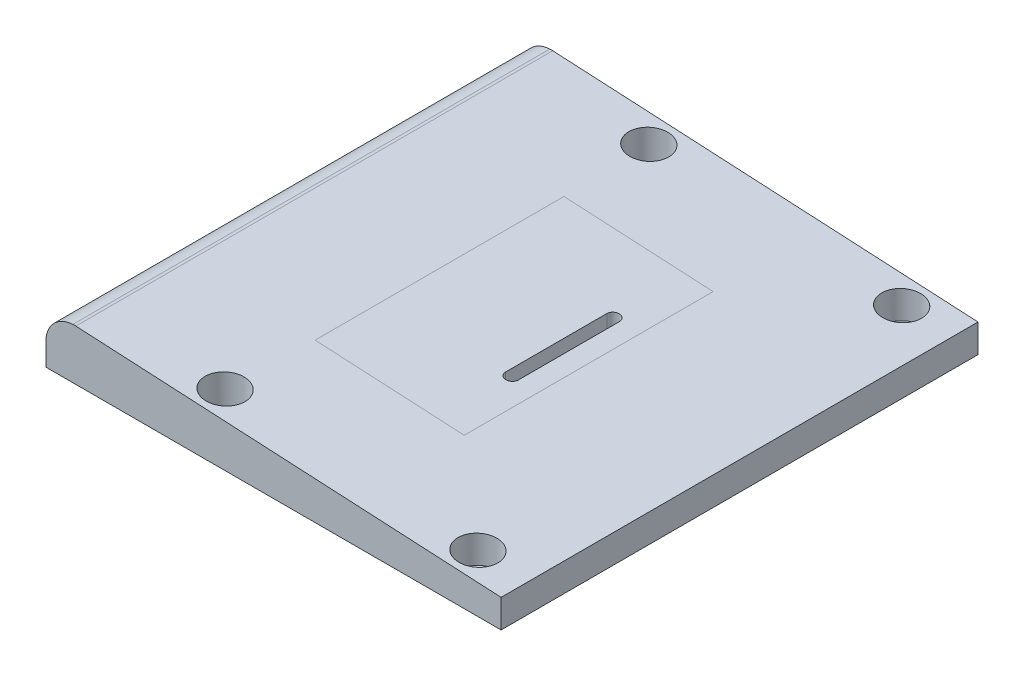
ISO-10303-21;
HEADER;
FILE_DESCRIPTION(('STEP AP214'),'2;1');
FILE_NAME('part.step','',(''),(''),'','','');
FILE_SCHEMA(('AUTOMOTIVE_DESIGN { 1 0 10303 214 1 1 1 1 }'));
ENDSEC;
DATA;
#1=APPLICATION_CONTEXT('core data for automotive mechanical design processes');
#2=APPLICATION_PROTOCOL_DEFINITION('international standard','automotive_design',2000,#1);
#3=PRODUCT_CONTEXT('',#1,'mechanical');
#4=PRODUCT('Part','Part','',(#3));
#5=PRODUCT_RELATED_PRODUCT_CATEGORY('part','',(#4));
#6=PRODUCT_DEFINITION_FORMATION('','',#4);
#7=PRODUCT_DEFINITION_CONTEXT('part definition',#1,'design');
#8=PRODUCT_DEFINITION('design','',#6,#7);
#9=PRODUCT_DEFINITION_SHAPE('','',#8);
#10=(LENGTH_UNIT() NAMED_UNIT(*) SI_UNIT(.MILLI.,.METRE.));
#11=(NAMED_UNIT(*) PLANE_ANGLE_UNIT() SI_UNIT($,.RADIAN.));
#12=(NAMED_UNIT(*) SI_UNIT($,.STERADIAN.) SOLID_ANGLE_UNIT());
#13=UNCERTAINTY_MEASURE_WITH_UNIT(LENGTH_MEASURE(1.E-05),#10,'distance_accuracy_value','');
#14=(GEOMETRIC_REPRESENTATION_CONTEXT(3) GLOBAL_UNCERTAINTY_ASSIGNED_CONTEXT((#13)) GLOBAL_UNIT_ASSIGNED_CONTEXT((#10,
#11,#12)) REPRESENTATION_CONTEXT('',''));
#15=CARTESIAN_POINT('',(0.,0.,0.));
#16=DIRECTION('',(0.,0.,1.));
#17=DIRECTION('',(1.,0.,0.));
#18=AXIS2_PLACEMENT_3D('',#15,#16,#17);
#19=CARTESIAN_POINT('',(0.742449908830771,14.1667881941932,-119.775));
#20=DIRECTION('',(0.0523359562429369,0.998629534754574,0.));
#21=DIRECTION('',(-0.998629534754574,0.0523359562429369,0.));
#22=AXIS2_PLACEMENT_3D('',#19,#20,#21);
#23=PLANE('',#22);
#24=DIRECTION('',(-0.998629534754574,0.0523359562429369,0.));
#25=VECTOR('',#24,1.);
#26=CARTESIAN_POINT('',(0.742449908830771,14.1667881941932,-62.5));
#27=LINE('',#26,#25);
#28=CARTESIAN_POINT('',(-75.7958688581697,18.1779915108286,-62.5));
#29=VERTEX_POINT('',#28);
#30=CARTESIAN_POINT('',(-150.693083964763,22.1031882290489,-62.5));
#31=VERTEX_POINT('',#30);
#32=EDGE_CURVE('E138',#29,#31,#27,.T.);
#33=ORIENTED_EDGE('',*,*,#32,.T.);
#34=DIRECTION('',(0.,0.,1.));
#35=VECTOR('',#34,1.);
#36=CARTESIAN_POINT('',(-150.693083964763,22.1031882290489,-119.775));
#37=LINE('',#36,#35);
#38=CARTESIAN_POINT('',(-150.693083964763,22.1031882290489,62.5));
#39=VERTEX_POINT('',#38);
#40=EDGE_CURVE('E149',#31,#39,#37,.T.);
#41=ORIENTED_EDGE('',*,*,#40,.T.);
#42=DIRECTION('',(0.998629534754574,-0.0523359562429369,0.));
#43=VECTOR('',#42,1.);
#44=CARTESIAN_POINT('',(0.742449908830805,14.1667881941932,62.5));
#45=LINE('',#44,#43);
#46=CARTESIAN_POINT('',(-75.7958688581697,18.1779915108286,62.5));
#47=VERTEX_POINT('',#46);
#48=EDGE_CURVE('E147',#39,#47,#45,.T.);
#49=ORIENTED_EDGE('',*,*,#48,.T.);
#50=DIRECTION('',(0.,0.,-1.));
#51=VECTOR('',#50,1.);
#52=CARTESIAN_POINT('',(-75.7958688581697,18.1779915108286,-119.775));
#53=LINE('',#52,#51);
#54=EDGE_CURVE('E131',#47,#29,#53,.T.);
#55=ORIENTED_EDGE('',*,*,#54,.T.);
#56=EDGE_LOOP('',(#33,#41,#49,#55));
#57=FACE_BOUND('',#56,.T.);
#58=DIRECTION('',(0.,0.,1.));
#59=VECTOR('',#58,1.);
#60=CARTESIAN_POINT('',(-85.725,18.698355224182,-119.775));
#61=LINE('',#60,#59);
#62=CARTESIAN_POINT('',(-85.725,18.698355224182,-25.4));
#63=VERTEX_POINT('',#62);
#64=CARTESIAN_POINT('',(-85.725,18.698355224182,25.4));
#65=VERTEX_POINT('',#64);
#66=EDGE_CURVE('E97',#63,#65,#61,.T.);
#67=ORIENTED_EDGE('',*,*,#66,.T.);
#68=CARTESIAN_POINT('',(-88.9,18.8647499234056,25.4));
#69=DIRECTION('',(0.0523359562429369,0.998629534754574,0.));
#70=DIRECTION('',(0.998629534754574,-0.0523359562429369,0.));
#71=AXIS2_PLACEMENT_3D('',#68,#69,#70);
#72=ELLIPSE('',#71,3.17935719854344,3.17500000000004);
#73=CARTESIAN_POINT('',(-92.075,19.0311446226293,25.4));
#74=VERTEX_POINT('',#73);
#75=EDGE_CURVE('E163',#65,#74,#72,.F.);
#76=ORIENTED_EDGE('',*,*,#75,.T.);
#77=DIRECTION('',(0.,0.,-1.));
#78=VECTOR('',#77,1.);
#79=CARTESIAN_POINT('',(-92.075,19.0311446226293,-119.775));
#80=LINE('',#79,#78);
#81=CARTESIAN_POINT('',(-92.075,19.0311446226293,-25.4));
#82=VERTEX_POINT('',#81);
#83=EDGE_CURVE('E178',#74,#82,#80,.T.);
#84=ORIENTED_EDGE('',*,*,#83,.T.);
#85=CARTESIAN_POINT('',(-88.9,18.8647499234056,-25.4));
#86=DIRECTION('',(0.0523359562429369,0.998629534754574,0.));
#87=DIRECTION('',(0.998629534754574,-0.0523359562429369,0.));
#88=AXIS2_PLACEMENT_3D('',#85,#86,#87);
#89=ELLIPSE('',#88,3.17935719854344,3.17500000000004);
#90=EDGE_CURVE('E181',#82,#63,#89,.F.);
#91=ORIENTED_EDGE('',*,*,#90,.T.);
#92=EDGE_LOOP('',(#67,#76,#84,#91));
#93=FACE_BOUND('',#92,.T.);
#94=ADVANCED_FACE('F54',(#57,#93),#23,.T.);
#95=CARTESIAN_POINT('',(0.,0.,0.));
#96=DIRECTION('',(0.,-1.,0.));
#97=DIRECTION('',(0.,0.,-1.));
#98=AXIS2_PLACEMENT_3D('',#95,#96,#97);
#99=PLANE('',#98);
#100=DIRECTION('',(-1.,0.,0.));
#101=VECTOR('',#100,1.);
#102=CARTESIAN_POINT('',(0.,0.,62.5));
#103=LINE('',#102,#101);
#104=CARTESIAN_POINT('',(-76.748537025078,0.,62.5));
#105=VERTEX_POINT('',#104);
#106=CARTESIAN_POINT('',(-151.851462974922,0.,62.5));
#107=VERTEX_POINT('',#106);
#108=EDGE_CURVE('E157',#105,#107,#103,.T.);
#109=ORIENTED_EDGE('',*,*,#108,.T.);
#110=DIRECTION('',(0.,0.,-1.));
#111=VECTOR('',#110,1.);
#112=CARTESIAN_POINT('',(-151.851462974922,0.,0.));
#113=LINE('',#112,#111);
#114=CARTESIAN_POINT('',(-151.851462974922,0.,-62.5));
#115=VERTEX_POINT('',#114);
#116=EDGE_CURVE('E160',#107,#115,#113,.T.);
#117=ORIENTED_EDGE('',*,*,#116,.T.);
#118=DIRECTION('',(1.,0.,0.));
#119=VECTOR('',#118,1.);
#120=CARTESIAN_POINT('',(0.,0.,-62.5));
#121=LINE('',#120,#119);
#122=CARTESIAN_POINT('',(-76.748537025078,0.,-62.5));
#123=VERTEX_POINT('',#122);
#124=EDGE_CURVE('E154',#115,#123,#121,.T.);
#125=ORIENTED_EDGE('',*,*,#124,.T.);
#126=DIRECTION('',(0.,0.,1.));
#127=VECTOR('',#126,1.);
#128=CARTESIAN_POINT('',(-76.748537025078,0.,0.));
#129=LINE('',#128,#127);
#130=EDGE_CURVE('E134',#123,#105,#129,.T.);
#131=ORIENTED_EDGE('',*,*,#130,.T.);
#132=EDGE_LOOP('',(#109,#117,#125,#131));
#133=FACE_BOUND('',#132,.T.);
#134=DIRECTION('',(0.,0.,-1.));
#135=VECTOR('',#134,1.);
#136=CARTESIAN_POINT('',(-92.075,0.,0.));
#137=LINE('',#136,#135);
#138=CARTESIAN_POINT('',(-92.075,0.,-25.4));
#139=VERTEX_POINT('',#138);
#140=CARTESIAN_POINT('',(-92.075,0.,25.4));
#141=VERTEX_POINT('',#140);
#142=EDGE_CURVE('E136',#139,#141,#137,.F.);
#143=ORIENTED_EDGE('',*,*,#142,.T.);
#144=CARTESIAN_POINT('',(-88.9,0.,25.4));
#145=DIRECTION('',(0.,-1.,0.));
#146=DIRECTION('',(0.,0.,-1.));
#147=AXIS2_PLACEMENT_3D('',#144,#145,#146);
#148=CIRCLE('',#147,3.17500000000004);
#149=CARTESIAN_POINT('',(-85.725,0.,25.4));
#150=VERTEX_POINT('',#149);
#151=EDGE_CURVE('E13',#141,#150,#148,.F.);
#152=ORIENTED_EDGE('',*,*,#151,.T.);
#153=DIRECTION('',(0.,0.,-1.));
#154=VECTOR('',#153,1.);
#155=CARTESIAN_POINT('',(-85.725,0.,0.));
#156=LINE('',#155,#154);
#157=CARTESIAN_POINT('',(-85.725,0.,-25.4));
#158=VERTEX_POINT('',#157);
#159=EDGE_CURVE('E63',#150,#158,#156,.T.);
#160=ORIENTED_EDGE('',*,*,#159,.T.);
#161=CARTESIAN_POINT('',(-88.9,0.,-25.4));
#162=DIRECTION('',(0.,-1.,0.));
#163=DIRECTION('',(0.,0.,-1.));
#164=AXIS2_PLACEMENT_3D('',#161,#162,#163);
#165=CIRCLE('',#164,3.17500000000004);
#166=EDGE_CURVE('E88',#158,#139,#165,.F.);
#167=ORIENTED_EDGE('',*,*,#166,.T.);
#168=EDGE_LOOP('',(#143,#152,#160,#167));
#169=FACE_BOUND('',#168,.T.);
#170=ADVANCED_FACE('F56',(#133,#169),#99,.T.);
#171=CARTESIAN_POINT('',(-77.164989485969,-7.9463863302033,-62.5));
#172=DIRECTION('',(0.,0.,-1.));
#173=DIRECTION('',(-1.,0.,0.));
#174=AXIS2_PLACEMENT_3D('',#171,#172,#173);
#175=PLANE('',#174);
#176=ORIENTED_EDGE('',*,*,#124,.F.);
#177=DIRECTION('',(0.0523359562429369,0.998629534754574,0.));
#178=VECTOR('',#177,1.);
#179=CARTESIAN_POINT('',(-152.062204592562,-4.02118961198303,-62.5));
#180=LINE('',#179,#178);
#181=EDGE_CURVE('E122',#115,#31,#180,.T.);
#182=ORIENTED_EDGE('',*,*,#181,.T.);
#183=ORIENTED_EDGE('',*,*,#32,.F.);
#184=DIRECTION('',(0.0523359562429369,0.998629534754574,0.));
#185=VECTOR('',#184,1.);
#186=CARTESIAN_POINT('',(-77.164989485969,-7.9463863302033,-62.5));
#187=LINE('',#186,#185);
#188=EDGE_CURVE('E128',#123,#29,#187,.T.);
#189=ORIENTED_EDGE('',*,*,#188,.F.);
#190=EDGE_LOOP('',(#176,#182,#183,#189));
#191=FACE_BOUND('',#190,.T.);
#192=ADVANCED_FACE('F139',(#191),#175,.T.);
#193=CARTESIAN_POINT('',(-152.062204592562,-4.02118961198303,62.5));
#194=DIRECTION('',(-0.998629534754574,0.0523359562429369,0.));
#195=DIRECTION('',(-0.0523359562429369,-0.998629534754574,0.));
#196=AXIS2_PLACEMENT_3D('',#193,#194,#195);
#197=PLANE('',#196);
#198=ORIENTED_EDGE('',*,*,#116,.F.);
#199=DIRECTION('',(0.0523359562429369,0.998629534754574,0.));
#200=VECTOR('',#199,1.);
#201=CARTESIAN_POINT('',(-152.062204592562,-4.02118961198303,62.5));
#202=LINE('',#201,#200);
#203=EDGE_CURVE('E143',#107,#39,#202,.T.);
#204=ORIENTED_EDGE('',*,*,#203,.T.);
#205=ORIENTED_EDGE('',*,*,#40,.F.);
#206=ORIENTED_EDGE('',*,*,#181,.F.);
#207=EDGE_LOOP('',(#198,#204,#205,#206));
#208=FACE_BOUND('',#207,.T.);
#209=ADVANCED_FACE('F196',(#208),#197,.T.);
#210=CARTESIAN_POINT('',(-77.164989485969,-7.9463863302033,62.5));
#211=DIRECTION('',(0.998629534754574,-0.0523359562429369,0.));
#212=DIRECTION('',(0.0523359562429369,0.998629534754574,0.));
#213=AXIS2_PLACEMENT_3D('',#210,#211,#212);
#214=PLANE('',#213);
#215=ORIENTED_EDGE('',*,*,#130,.F.);
#216=ORIENTED_EDGE('',*,*,#188,.T.);
#217=ORIENTED_EDGE('',*,*,#54,.F.);
#218=DIRECTION('',(0.0523359562429369,0.998629534754574,0.));
#219=VECTOR('',#218,1.);
#220=CARTESIAN_POINT('',(-77.164989485969,-7.9463863302033,62.5));
#221=LINE('',#220,#219);
#222=EDGE_CURVE('E193',#105,#47,#221,.T.);
#223=ORIENTED_EDGE('',*,*,#222,.F.);
#224=EDGE_LOOP('',(#215,#216,#217,#223));
#225=FACE_BOUND('',#224,.T.);
#226=ADVANCED_FACE('F129',(#225),#214,.T.);
#227=CARTESIAN_POINT('',(-77.164989485969,-7.9463863302033,62.5));
#228=DIRECTION('',(0.,0.,1.));
#229=DIRECTION('',(1.,0.,0.));
#230=AXIS2_PLACEMENT_3D('',#227,#228,#229);
#231=PLANE('',#230);
#232=ORIENTED_EDGE('',*,*,#108,.F.);
#233=ORIENTED_EDGE('',*,*,#222,.T.);
#234=ORIENTED_EDGE('',*,*,#48,.F.);
#235=ORIENTED_EDGE('',*,*,#203,.F.);
#236=EDGE_LOOP('',(#232,#233,#234,#235));
#237=FACE_BOUND('',#236,.T.);
#238=ADVANCED_FACE('F199',(#237),#231,.T.);
#239=CARTESIAN_POINT('',(-88.9,25.4,25.4));
#240=DIRECTION('',(0.,-1.,0.));
#241=DIRECTION('',(0.,0.,-1.));
#242=AXIS2_PLACEMENT_3D('',#239,#240,#241);
#243=CYLINDRICAL_SURFACE('',#242,3.17500000000004);
#244=DIRECTION('',(0.,-1.,0.));
#245=VECTOR('',#244,1.);
#246=CARTESIAN_POINT('',(-85.725,25.4,25.4));
#247=LINE('',#246,#245);
#248=EDGE_CURVE('E172',#65,#150,#247,.T.);
#249=ORIENTED_EDGE('',*,*,#248,.T.);
#250=ORIENTED_EDGE('',*,*,#151,.F.);
#251=DIRECTION('',(0.,-1.,0.));
#252=VECTOR('',#251,1.);
#253=CARTESIAN_POINT('',(-92.075,25.4,25.4));
#254=LINE('',#253,#252);
#255=EDGE_CURVE('E185',#74,#141,#254,.T.);
#256=ORIENTED_EDGE('',*,*,#255,.F.);
#257=ORIENTED_EDGE('',*,*,#75,.F.);
#258=EDGE_LOOP('',(#249,#250,#256,#257));
#259=FACE_BOUND('',#258,.T.);
#260=ADVANCED_FACE('F175',(#259),#243,.F.);
#261=CARTESIAN_POINT('',(-85.725,25.4,25.4));
#262=DIRECTION('',(-1.,0.,0.));
#263=DIRECTION('',(0.,0.,1.));
#264=AXIS2_PLACEMENT_3D('',#261,#262,#263);
#265=PLANE('',#264);
#266=DIRECTION('',(0.,-1.,0.));
#267=VECTOR('',#266,1.);
#268=CARTESIAN_POINT('',(-85.725,25.4,-25.4));
#269=LINE('',#268,#267);
#270=EDGE_CURVE('E173',#63,#158,#269,.T.);
#271=ORIENTED_EDGE('',*,*,#270,.T.);
#272=ORIENTED_EDGE('',*,*,#159,.F.);
#273=ORIENTED_EDGE('',*,*,#248,.F.);
#274=ORIENTED_EDGE('',*,*,#66,.F.);
#275=EDGE_LOOP('',(#271,#272,#273,#274));
#276=FACE_BOUND('',#275,.T.);
#277=ADVANCED_FACE('F171',(#276),#265,.T.);
#278=CARTESIAN_POINT('',(-88.9,25.4,-25.4));
#279=DIRECTION('',(0.,-1.,0.));
#280=DIRECTION('',(0.,0.,-1.));
#281=AXIS2_PLACEMENT_3D('',#278,#279,#280);
#282=CYLINDRICAL_SURFACE('',#281,3.17500000000004);
#283=DIRECTION('',(0.,-1.,0.));
#284=VECTOR('',#283,1.);
#285=CARTESIAN_POINT('',(-92.075,25.4,-25.4));
#286=LINE('',#285,#284);
#287=EDGE_CURVE('E71',#82,#139,#286,.T.);
#288=ORIENTED_EDGE('',*,*,#287,.T.);
#289=ORIENTED_EDGE('',*,*,#166,.F.);
#290=ORIENTED_EDGE('',*,*,#270,.F.);
#291=ORIENTED_EDGE('',*,*,#90,.F.);
#292=EDGE_LOOP('',(#288,#289,#290,#291));
#293=FACE_BOUND('',#292,.T.);
#294=ADVANCED_FACE('F222',(#293),#282,.F.);
#295=CARTESIAN_POINT('',(-92.075,25.4,-25.4));
#296=DIRECTION('',(1.,0.,0.));
#297=DIRECTION('',(0.,0.,-1.));
#298=AXIS2_PLACEMENT_3D('',#295,#296,#297);
#299=PLANE('',#298);
#300=ORIENTED_EDGE('',*,*,#255,.T.);
#301=ORIENTED_EDGE('',*,*,#142,.F.);
#302=ORIENTED_EDGE('',*,*,#287,.F.);
#303=ORIENTED_EDGE('',*,*,#83,.F.);
#304=EDGE_LOOP('',(#300,#301,#302,#303));
#305=FACE_BOUND('',#304,.T.);
#306=ADVANCED_FACE('F225',(#305),#299,.T.);
#307=CLOSED_SHELL('',(#94,#170,#192,#209,#226,#238,#260,#277,#294,#306));
#308=MANIFOLD_SOLID_BREP('B2',#307);
#309=CARTESIAN_POINT('',(-77.164989485969,-7.9463863302033,-62.5));
#310=DIRECTION('',(0.,0.,-1.));
#311=DIRECTION('',(-1.,0.,0.));
#312=AXIS2_PLACEMENT_3D('',#309,#310,#311);
#313=PLANE('',#312);
#314=DIRECTION('',(1.,0.,0.));
#315=VECTOR('',#314,1.);
#316=CARTESIAN_POINT('',(0.,0.,-62.5));
#317=LINE('',#316,#315);
#318=CARTESIAN_POINT('',(-151.851462974922,0.,-62.5));
#319=VERTEX_POINT('',#318);
#320=CARTESIAN_POINT('',(-76.748537025078,0.,-62.5));
#321=VERTEX_POINT('',#320);
#322=EDGE_CURVE('E430',#319,#321,#317,.T.);
#323=ORIENTED_EDGE('',*,*,#322,.T.);
#324=DIRECTION('',(0.0523359562429369,0.998629534754574,0.));
#325=VECTOR('',#324,1.);
#326=CARTESIAN_POINT('',(-77.164989485969,-7.9463863302033,-62.5));
#327=LINE('',#326,#325);
#328=CARTESIAN_POINT('',(-75.7958688581697,18.1779915108286,-62.5));
#329=VERTEX_POINT('',#328);
#330=EDGE_CURVE('E52',#321,#329,#327,.T.);
#331=ORIENTED_EDGE('',*,*,#330,.T.);
#332=DIRECTION('',(-0.998629534754574,0.0523359562429369,0.));
#333=VECTOR('',#332,1.);
#334=CARTESIAN_POINT('',(0.742449908830771,14.1667881941932,-62.5));
#335=LINE('',#334,#333);
#336=CARTESIAN_POINT('',(-150.693083964763,22.1031882290489,-62.5));
#337=VERTEX_POINT('',#336);
#338=EDGE_CURVE('E292',#329,#337,#335,.T.);
#339=ORIENTED_EDGE('',*,*,#338,.T.);
#340=DIRECTION('',(0.0523359562429369,0.998629534754574,0.));
#341=VECTOR('',#340,1.);
#342=CARTESIAN_POINT('',(-152.062204592562,-4.02118961198303,-62.5));
#343=LINE('',#342,#341);
#344=EDGE_CURVE('E284',#319,#337,#343,.T.);
#345=ORIENTED_EDGE('',*,*,#344,.F.);
#346=EDGE_LOOP('',(#323,#331,#339,#345));
#347=FACE_BOUND('',#346,.T.);
#348=ADVANCED_FACE('F275',(#347),#313,.F.);
#349=CARTESIAN_POINT('',(-77.164989485969,-7.9463863302033,62.5));
#350=DIRECTION('',(0.998629534754574,-0.0523359562429369,0.));
#351=DIRECTION('',(0.0523359562429369,0.998629534754574,0.));
#352=AXIS2_PLACEMENT_3D('',#349,#350,#351);
#353=PLANE('',#352);
#354=DIRECTION('',(0.,0.,1.));
#355=VECTOR('',#354,1.);
#356=CARTESIAN_POINT('',(-76.748537025078,0.,0.));
#357=LINE('',#356,#355);
#358=CARTESIAN_POINT('',(-76.748537025078,0.,62.5));
#359=VERTEX_POINT('',#358);
#360=EDGE_CURVE('E439',#321,#359,#357,.T.);
#361=ORIENTED_EDGE('',*,*,#360,.T.);
#362=DIRECTION('',(0.0523359562429369,0.998629534754574,0.));
#363=VECTOR('',#362,1.);
#364=CARTESIAN_POINT('',(-77.164989485969,-7.9463863302033,62.5));
#365=LINE('',#364,#363);
#366=CARTESIAN_POINT('',(-75.7958688581697,18.1779915108286,62.5));
#367=VERTEX_POINT('',#366);
#368=EDGE_CURVE('E433',#359,#367,#365,.T.);
#369=ORIENTED_EDGE('',*,*,#368,.T.);
#370=DIRECTION('',(0.,0.,-1.));
#371=VECTOR('',#370,1.);
#372=CARTESIAN_POINT('',(-75.7958688581697,18.1779915108286,-119.775));
#373=LINE('',#372,#371);
#374=EDGE_CURVE('E421',#367,#329,#373,.T.);
#375=ORIENTED_EDGE('',*,*,#374,.T.);
#376=ORIENTED_EDGE('',*,*,#330,.F.);
#377=EDGE_LOOP('',(#361,#369,#375,#376));
#378=FACE_BOUND('',#377,.T.);
#379=ADVANCED_FACE('F454',(#378),#353,.F.);
#380=CARTESIAN_POINT('',(-77.164989485969,-7.9463863302033,62.5));
#381=DIRECTION('',(0.,0.,1.));
#382=DIRECTION('',(1.,0.,0.));
#383=AXIS2_PLACEMENT_3D('',#380,#381,#382);
#384=PLANE('',#383);
#385=DIRECTION('',(-1.,0.,0.));
#386=VECTOR('',#385,1.);
#387=CARTESIAN_POINT('',(0.,0.,62.5));
#388=LINE('',#387,#386);
#389=CARTESIAN_POINT('',(-151.851462974922,0.,62.5));
#390=VERTEX_POINT('',#389);
#391=EDGE_CURVE('E440',#359,#390,#388,.T.);
#392=ORIENTED_EDGE('',*,*,#391,.T.);
#393=DIRECTION('',(0.0523359562429369,0.998629534754574,0.));
#394=VECTOR('',#393,1.);
#395=CARTESIAN_POINT('',(-152.062204592562,-4.02118961198303,62.5));
#396=LINE('',#395,#394);
#397=CARTESIAN_POINT('',(-150.693083964763,22.1031882290489,62.5));
#398=VERTEX_POINT('',#397);
#399=EDGE_CURVE('E420',#390,#398,#396,.T.);
#400=ORIENTED_EDGE('',*,*,#399,.T.);
#401=DIRECTION('',(0.998629534754574,-0.0523359562429369,0.));
#402=VECTOR('',#401,1.);
#403=CARTESIAN_POINT('',(0.742449908830805,14.1667881941932,62.5));
#404=LINE('',#403,#402);
#405=EDGE_CURVE('E424',#398,#367,#404,.T.);
#406=ORIENTED_EDGE('',*,*,#405,.T.);
#407=ORIENTED_EDGE('',*,*,#368,.F.);
#408=EDGE_LOOP('',(#392,#400,#406,#407));
#409=FACE_BOUND('',#408,.T.);
#410=ADVANCED_FACE('F460',(#409),#384,.F.);
#411=CARTESIAN_POINT('',(-152.062204592562,-4.02118961198303,62.5));
#412=DIRECTION('',(-0.998629534754574,0.0523359562429369,0.));
#413=DIRECTION('',(-0.0523359562429369,-0.998629534754574,0.));
#414=AXIS2_PLACEMENT_3D('',#411,#412,#413);
#415=PLANE('',#414);
#416=DIRECTION('',(0.,0.,-1.));
#417=VECTOR('',#416,1.);
#418=CARTESIAN_POINT('',(-151.851462974922,0.,0.));
#419=LINE('',#418,#417);
#420=EDGE_CURVE('E279',#390,#319,#419,.T.);
#421=ORIENTED_EDGE('',*,*,#420,.T.);
#422=ORIENTED_EDGE('',*,*,#344,.T.);
#423=DIRECTION('',(0.,0.,1.));
#424=VECTOR('',#423,1.);
#425=CARTESIAN_POINT('',(-150.693083964763,22.1031882290489,-119.775));
#426=LINE('',#425,#424);
#427=EDGE_CURVE('E427',#337,#398,#426,.T.);
#428=ORIENTED_EDGE('',*,*,#427,.T.);
#429=ORIENTED_EDGE('',*,*,#399,.F.);
#430=EDGE_LOOP('',(#421,#422,#428,#429));
#431=FACE_BOUND('',#430,.T.);
#432=ADVANCED_FACE('F277',(#431),#415,.F.);
#433=CARTESIAN_POINT('',(-214.350571922434,11.0782345540564,-119.775));
#434=DIRECTION('',(0.,0.,1.));
#435=DIRECTION('',(1.,0.,0.));
#436=AXIS2_PLACEMENT_3D('',#433,#434,#435);
#437=CYLINDRICAL_SURFACE('',#436,14.3414198634365);
#438=DIRECTION('',(0.,0.,1.));
#439=VECTOR('',#438,1.);
#440=CARTESIAN_POINT('',(-215.101143844869,25.4,-119.775));
#441=LINE('',#440,#439);
#442=CARTESIAN_POINT('',(-215.101143844869,25.4,-119.775));
#443=VERTEX_POINT('',#442);
#444=CARTESIAN_POINT('',(-215.101143844869,25.4,119.775));
#445=VERTEX_POINT('',#444);
#446=EDGE_CURVE('E375',#443,#445,#441,.T.);
#447=ORIENTED_EDGE('',*,*,#446,.F.);
#448=CARTESIAN_POINT('',(-214.350571922434,11.0782345540564,-119.775));
#449=DIRECTION('',(0.,0.,1.));
#450=DIRECTION('',(1.,0.,0.));
#451=AXIS2_PLACEMENT_3D('',#448,#449,#450);
#452=CIRCLE('',#451,14.3414198634365);
#453=CARTESIAN_POINT('',(-228.6,12.7,-119.775));
#454=VERTEX_POINT('',#453);
#455=EDGE_CURVE('E515',#443,#454,#452,.T.);
#456=ORIENTED_EDGE('',*,*,#455,.T.);
#457=DIRECTION('',(0.,0.,1.));
#458=VECTOR('',#457,1.);
#459=CARTESIAN_POINT('',(-228.6,12.7,-119.775));
#460=LINE('',#459,#458);
#461=CARTESIAN_POINT('',(-228.6,12.7,119.775));
#462=VERTEX_POINT('',#461);
#463=EDGE_CURVE('E402',#454,#462,#460,.T.);
#464=ORIENTED_EDGE('',*,*,#463,.T.);
#465=CARTESIAN_POINT('',(-214.350571922434,11.0782345540564,119.775));
#466=DIRECTION('',(0.,0.,1.));
#467=DIRECTION('',(1.,0.,0.));
#468=AXIS2_PLACEMENT_3D('',#465,#466,#467);
#469=CIRCLE('',#468,14.3414198634365);
#470=EDGE_CURVE('E371',#445,#462,#469,.T.);
#471=ORIENTED_EDGE('',*,*,#470,.F.);
#472=EDGE_LOOP('',(#447,#456,#464,#471));
#473=FACE_BOUND('',#472,.T.);
#474=ADVANCED_FACE('F470',(#473),#437,.T.);
#475=CARTESIAN_POINT('',(-149.25,1.83965441749289,106.425));
#476=DIRECTION('',(0.,-1.,0.));
#477=DIRECTION('',(0.,0.,-1.));
#478=AXIS2_PLACEMENT_3D('',#475,#476,#477);
#479=PLANE('',#478);
#480=CARTESIAN_POINT('',(-152.,1.83965441749289,106.425));
#481=DIRECTION('',(0.,1.,0.));
#482=DIRECTION('',(0.,0.,1.));
#483=AXIS2_PLACEMENT_3D('',#480,#481,#482);
#484=CIRCLE('',#483,2.75);
#485=CARTESIAN_POINT('',(-152.,1.83965441749289,109.175));
#486=VERTEX_POINT('',#485);
#487=EDGE_CURVE('E525',#486,#486,#484,.T.);
#488=ORIENTED_EDGE('',*,*,#487,.F.);
#489=EDGE_LOOP('',(#488));
#490=FACE_BOUND('',#489,.T.);
#491=CARTESIAN_POINT('',(-152.,1.83965441749289,106.425));
#492=DIRECTION('',(0.,1.,0.));
#493=DIRECTION('',(0.,0.,1.));
#494=AXIS2_PLACEMENT_3D('',#491,#492,#493);
#495=CIRCLE('',#494,9.99999999999998);
#496=CARTESIAN_POINT('',(-152.,1.83965441749289,116.425));
#497=VERTEX_POINT('',#496);
#498=EDGE_CURVE('E407',#497,#497,#495,.T.);
#499=ORIENTED_EDGE('',*,*,#498,.T.);
#500=EDGE_LOOP('',(#499));
#501=FACE_BOUND('',#500,.T.);
#502=ADVANCED_FACE('F475',(#490,#501),#479,.F.);
#503=CARTESIAN_POINT('',(-22.25,1.83965441749289,106.425));
#504=DIRECTION('',(0.,-1.,0.));
#505=DIRECTION('',(0.,0.,-1.));
#506=AXIS2_PLACEMENT_3D('',#503,#504,#505);
#507=PLANE('',#506);
#508=CARTESIAN_POINT('',(-25.,1.83965441749289,106.425));
#509=DIRECTION('',(0.,1.,0.));
#510=DIRECTION('',(0.,0.,1.));
#511=AXIS2_PLACEMENT_3D('',#508,#509,#510);
#512=CIRCLE('',#511,2.75);
#513=CARTESIAN_POINT('',(-25.,1.83965441749289,109.175));
#514=VERTEX_POINT('',#513);
#515=EDGE_CURVE('E532',#514,#514,#512,.T.);
#516=ORIENTED_EDGE('',*,*,#515,.F.);
#517=EDGE_LOOP('',(#516));
#518=FACE_BOUND('',#517,.T.);
#519=CARTESIAN_POINT('',(-25.,1.83965441749289,106.425));
#520=DIRECTION('',(0.,1.,0.));
#521=DIRECTION('',(0.,0.,1.));
#522=AXIS2_PLACEMENT_3D('',#519,#520,#521);
#523=CIRCLE('',#522,9.99999999999999);
#524=CARTESIAN_POINT('',(-25.,1.83965441749289,116.425));
#525=VERTEX_POINT('',#524);
#526=EDGE_CURVE('E412',#525,#525,#523,.T.);
#527=ORIENTED_EDGE('',*,*,#526,.T.);
#528=EDGE_LOOP('',(#527));
#529=FACE_BOUND('',#528,.T.);
#530=ADVANCED_FACE('F575',(#518,#529),#507,.F.);
#531=CARTESIAN_POINT('',(-22.25,1.83965441749289,-106.425));
#532=DIRECTION('',(0.,-1.,0.));
#533=DIRECTION('',(0.,0.,-1.));
#534=AXIS2_PLACEMENT_3D('',#531,#532,#533);
#535=PLANE('',#534);
#536=CARTESIAN_POINT('',(-25.,1.83965441749289,-106.425));
#537=DIRECTION('',(0.,1.,0.));
#538=DIRECTION('',(0.,0.,1.));
#539=AXIS2_PLACEMENT_3D('',#536,#537,#538);
#540=CIRCLE('',#539,2.75);
#541=CARTESIAN_POINT('',(-25.,1.83965441749289,-103.675));
#542=VERTEX_POINT('',#541);
#543=EDGE_CURVE('E539',#542,#542,#540,.T.);
#544=ORIENTED_EDGE('',*,*,#543,.F.);
#545=EDGE_LOOP('',(#544));
#546=FACE_BOUND('',#545,.T.);
#547=CARTESIAN_POINT('',(-25.,1.83965441749289,-106.425));
#548=DIRECTION('',(0.,1.,0.));
#549=DIRECTION('',(0.,0.,1.));
#550=AXIS2_PLACEMENT_3D('',#547,#548,#549);
#551=CIRCLE('',#550,9.99999999999999);
#552=CARTESIAN_POINT('',(-25.,1.83965441749289,-96.425));
#553=VERTEX_POINT('',#552);
#554=EDGE_CURVE('E417',#553,#553,#551,.T.);
#555=ORIENTED_EDGE('',*,*,#554,.T.);
#556=EDGE_LOOP('',(#555));
#557=FACE_BOUND('',#556,.T.);
#558=ADVANCED_FACE('F570',(#546,#557),#535,.F.);
#559=CARTESIAN_POINT('',(-149.25,1.83965441749289,-106.425));
#560=DIRECTION('',(0.,-1.,0.));
#561=DIRECTION('',(0.,0.,-1.));
#562=AXIS2_PLACEMENT_3D('',#559,#560,#561);
#563=PLANE('',#562);
#564=CARTESIAN_POINT('',(-152.,1.83965441749289,-106.425));
#565=DIRECTION('',(0.,1.,0.));
#566=DIRECTION('',(0.,0.,1.));
#567=AXIS2_PLACEMENT_3D('',#564,#565,#566);
#568=CIRCLE('',#567,2.75);
#569=CARTESIAN_POINT('',(-152.,1.83965441749289,-103.675));
#570=VERTEX_POINT('',#569);
#571=EDGE_CURVE('E546',#570,#570,#568,.T.);
#572=ORIENTED_EDGE('',*,*,#571,.F.);
#573=EDGE_LOOP('',(#572));
#574=FACE_BOUND('',#573,.T.);
#575=CARTESIAN_POINT('',(-152.,1.83965441749289,-106.425));
#576=DIRECTION('',(0.,1.,0.));
#577=DIRECTION('',(0.,0.,1.));
#578=AXIS2_PLACEMENT_3D('',#575,#576,#577);
#579=CIRCLE('',#578,9.99999999999998);
#580=CARTESIAN_POINT('',(-152.,1.83965441749289,-96.425));
#581=VERTEX_POINT('',#580);
#582=EDGE_CURVE('E549',#581,#581,#579,.T.);
#583=ORIENTED_EDGE('',*,*,#582,.T.);
#584=EDGE_LOOP('',(#583));
#585=FACE_BOUND('',#584,.T.);
#586=ADVANCED_FACE('F493',(#574,#585),#563,.F.);
#587=CARTESIAN_POINT('',(-228.6,25.4,119.775));
#588=DIRECTION('',(1.,0.,0.));
#589=DIRECTION('',(0.,0.,-1.));
#590=AXIS2_PLACEMENT_3D('',#587,#588,#589);
#591=PLANE('',#590);
#592=ORIENTED_EDGE('',*,*,#463,.F.);
#593=DIRECTION('',(0.,-1.,0.));
#594=VECTOR('',#593,1.);
#595=CARTESIAN_POINT('',(-228.6,25.4,-119.775));
#596=LINE('',#595,#594);
#597=CARTESIAN_POINT('',(-228.6,0.,-119.775));
#598=VERTEX_POINT('',#597);
#599=EDGE_CURVE('E395',#454,#598,#596,.T.);
#600=ORIENTED_EDGE('',*,*,#599,.T.);
#601=DIRECTION('',(0.,0.,1.));
#602=VECTOR('',#601,1.);
#603=CARTESIAN_POINT('',(-228.6,0.,119.775));
#604=LINE('',#603,#602);
#605=CARTESIAN_POINT('',(-228.6,0.,119.775));
#606=VERTEX_POINT('',#605);
#607=EDGE_CURVE('E390',#598,#606,#604,.T.);
#608=ORIENTED_EDGE('',*,*,#607,.T.);
#609=DIRECTION('',(0.,-1.,0.));
#610=VECTOR('',#609,1.);
#611=CARTESIAN_POINT('',(-228.6,25.4,119.775));
#612=LINE('',#611,#610);
#613=EDGE_CURVE('E378',#462,#606,#612,.T.);
#614=ORIENTED_EDGE('',*,*,#613,.F.);
#615=EDGE_LOOP('',(#592,#600,#608,#614));
#616=FACE_BOUND('',#615,.T.);
#617=ADVANCED_FACE('F491',(#616),#591,.F.);
#618=CARTESIAN_POINT('',(-228.6,25.4,119.775));
#619=DIRECTION('',(0.,0.,-1.));
#620=DIRECTION('',(-1.,0.,0.));
#621=AXIS2_PLACEMENT_3D('',#618,#619,#620);
#622=PLANE('',#621);
#623=DIRECTION('',(-0.998629534754574,0.0523359562429369,0.));
#624=VECTOR('',#623,1.);
#625=CARTESIAN_POINT('',(0.742449908830771,14.1667881941932,119.775));
#626=LINE('',#625,#624);
#627=CARTESIAN_POINT('',(0.,14.2056983451439,119.775));
#628=VERTEX_POINT('',#627);
#629=CARTESIAN_POINT('',(-213.6,25.4,119.775));
#630=VERTEX_POINT('',#629);
#631=EDGE_CURVE('E353',#628,#630,#626,.T.);
#632=ORIENTED_EDGE('',*,*,#631,.T.);
#633=DIRECTION('',(1.,0.,0.));
#634=VECTOR('',#633,1.);
#635=CARTESIAN_POINT('',(-228.6,25.4,119.775));
#636=LINE('',#635,#634);
#637=EDGE_CURVE('E368',#445,#630,#636,.T.);
#638=ORIENTED_EDGE('',*,*,#637,.F.);
#639=ORIENTED_EDGE('',*,*,#470,.T.);
#640=ORIENTED_EDGE('',*,*,#613,.T.);
#641=DIRECTION('',(1.,0.,0.));
#642=VECTOR('',#641,1.);
#643=CARTESIAN_POINT('',(-228.6,0.,119.775));
#644=LINE('',#643,#642);
#645=CARTESIAN_POINT('',(0.,0.,119.775));
#646=VERTEX_POINT('',#645);
#647=EDGE_CURVE('E380',#606,#646,#644,.T.);
#648=ORIENTED_EDGE('',*,*,#647,.T.);
#649=DIRECTION('',(0.,-1.,0.));
#650=VECTOR('',#649,1.);
#651=CARTESIAN_POINT('',(0.,25.4,119.775));
#652=LINE('',#651,#650);
#653=EDGE_CURVE('E370',#628,#646,#652,.T.);
#654=ORIENTED_EDGE('',*,*,#653,.F.);
#655=EDGE_LOOP('',(#632,#638,#639,#640,#648,#654));
#656=FACE_BOUND('',#655,.T.);
#657=ADVANCED_FACE('F366',(#656),#622,.F.);
#658=CARTESIAN_POINT('',(0.,25.4,0.));
#659=DIRECTION('',(0.,-1.,0.));
#660=DIRECTION('',(0.,0.,-1.));
#661=AXIS2_PLACEMENT_3D('',#658,#659,#660);
#662=PLANE('',#661);
#663=DIRECTION('',(0.,0.,1.));
#664=VECTOR('',#663,1.);
#665=CARTESIAN_POINT('',(-213.6,25.4,-119.775));
#666=LINE('',#665,#664);
#667=CARTESIAN_POINT('',(-213.6,25.4,-119.775));
#668=VERTEX_POINT('',#667);
#669=EDGE_CURVE('E350',#668,#630,#666,.T.);
#670=ORIENTED_EDGE('',*,*,#669,.F.);
#671=DIRECTION('',(-1.,0.,0.));
#672=VECTOR('',#671,1.);
#673=CARTESIAN_POINT('',(-228.6,25.4,-119.775));
#674=LINE('',#673,#672);
#675=EDGE_CURVE('E376',#668,#443,#674,.T.);
#676=ORIENTED_EDGE('',*,*,#675,.T.);
#677=ORIENTED_EDGE('',*,*,#446,.T.);
#678=ORIENTED_EDGE('',*,*,#637,.T.);
#679=EDGE_LOOP('',(#670,#676,#677,#678));
#680=FACE_BOUND('',#679,.T.);
#681=ADVANCED_FACE('F374',(#680),#662,.F.);
#682=CARTESIAN_POINT('',(-228.6,25.4,-119.775));
#683=DIRECTION('',(0.,0.,1.));
#684=DIRECTION('',(1.,0.,0.));
#685=AXIS2_PLACEMENT_3D('',#682,#683,#684);
#686=PLANE('',#685);
#687=DIRECTION('',(-0.998629534754574,0.0523359562429369,0.));
#688=VECTOR('',#687,1.);
#689=CARTESIAN_POINT('',(0.742449908830771,14.1667881941932,-119.775));
#690=LINE('',#689,#688);
#691=CARTESIAN_POINT('',(0.,14.2056983451439,-119.775));
#692=VERTEX_POINT('',#691);
#693=EDGE_CURVE('E356',#692,#668,#690,.T.);
#694=ORIENTED_EDGE('',*,*,#693,.F.);
#695=DIRECTION('',(0.,-1.,0.));
#696=VECTOR('',#695,1.);
#697=CARTESIAN_POINT('',(0.,25.4,-119.775));
#698=LINE('',#697,#696);
#699=CARTESIAN_POINT('',(0.,0.,-119.775));
#700=VERTEX_POINT('',#699);
#701=EDGE_CURVE('E397',#692,#700,#698,.T.);
#702=ORIENTED_EDGE('',*,*,#701,.T.);
#703=DIRECTION('',(-1.,0.,0.));
#704=VECTOR('',#703,1.);
#705=CARTESIAN_POINT('',(-228.6,0.,-119.775));
#706=LINE('',#705,#704);
#707=EDGE_CURVE('E387',#700,#598,#706,.T.);
#708=ORIENTED_EDGE('',*,*,#707,.T.);
#709=ORIENTED_EDGE('',*,*,#599,.F.);
#710=ORIENTED_EDGE('',*,*,#455,.F.);
#711=ORIENTED_EDGE('',*,*,#675,.F.);
#712=EDGE_LOOP('',(#694,#702,#708,#709,#710,#711));
#713=FACE_BOUND('',#712,.T.);
#714=ADVANCED_FACE('F495',(#713),#686,.F.);
#715=CARTESIAN_POINT('',(0.,25.4,119.775));
#716=DIRECTION('',(-1.,0.,0.));
#717=DIRECTION('',(0.,0.,1.));
#718=AXIS2_PLACEMENT_3D('',#715,#716,#717);
#719=PLANE('',#718);
#720=DIRECTION('',(0.,0.,1.));
#721=VECTOR('',#720,1.);
#722=CARTESIAN_POINT('',(0.,14.2056983451439,-119.775));
#723=LINE('',#722,#721);
#724=EDGE_CURVE('E361',#692,#628,#723,.T.);
#725=ORIENTED_EDGE('',*,*,#724,.T.);
#726=ORIENTED_EDGE('',*,*,#653,.T.);
#727=DIRECTION('',(0.,0.,-1.));
#728=VECTOR('',#727,1.);
#729=CARTESIAN_POINT('',(0.,0.,119.775));
#730=LINE('',#729,#728);
#731=EDGE_CURVE('E384',#646,#700,#730,.T.);
#732=ORIENTED_EDGE('',*,*,#731,.T.);
#733=ORIENTED_EDGE('',*,*,#701,.F.);
#734=EDGE_LOOP('',(#725,#726,#732,#733));
#735=FACE_BOUND('',#734,.T.);
#736=ADVANCED_FACE('F464',(#735),#719,.F.);
#737=CARTESIAN_POINT('',(-152.,25.4196544174929,106.425));
#738=DIRECTION('',(0.,1.,0.));
#739=DIRECTION('',(0.,0.,1.));
#740=AXIS2_PLACEMENT_3D('',#737,#738,#739);
#741=CYLINDRICAL_SURFACE('',#740,9.99999999999999);
#742=CARTESIAN_POINT('',(-152.,22.1716807961651,106.425));
#743=DIRECTION('',(0.0523359562429369,0.998629534754574,0.));
#744=DIRECTION('',(-0.998629534754574,0.0523359562429369,0.));
#745=AXIS2_PLACEMENT_3D('',#742,#743,#744);
#746=ELLIPSE('',#745,10.0137234599792,9.99999999999999);
#747=CARTESIAN_POINT('',(-162.,22.6957585889954,106.425));
#748=VERTEX_POINT('',#747);
#749=EDGE_CURVE('E399',#748,#748,#746,.T.);
#750=ORIENTED_EDGE('',*,*,#749,.T.);
#751=EDGE_LOOP('',(#750));
#752=FACE_BOUND('',#751,.T.);
#753=ORIENTED_EDGE('',*,*,#498,.F.);
#754=EDGE_LOOP('',(#753));
#755=FACE_BOUND('',#754,.T.);
#756=ADVANCED_FACE('F503',(#752,#755),#741,.F.);
#757=CARTESIAN_POINT('',(-25.,25.4196544174929,106.425));
#758=DIRECTION('',(0.,1.,0.));
#759=DIRECTION('',(0.,0.,1.));
#760=AXIS2_PLACEMENT_3D('',#757,#758,#759);
#761=CYLINDRICAL_SURFACE('',#760,10.);
#762=CARTESIAN_POINT('',(-25.,15.5158928272197,106.425));
#763=DIRECTION('',(0.0523359562429369,0.998629534754574,0.));
#764=DIRECTION('',(-0.998629534754574,0.0523359562429369,0.));
#765=AXIS2_PLACEMENT_3D('',#762,#763,#764);
#766=ELLIPSE('',#765,10.0137234599792,10.);
#767=CARTESIAN_POINT('',(-35.,16.0399706200501,106.425));
#768=VERTEX_POINT('',#767);
#769=EDGE_CURVE('E404',#768,#768,#766,.T.);
#770=ORIENTED_EDGE('',*,*,#769,.T.);
#771=EDGE_LOOP('',(#770));
#772=FACE_BOUND('',#771,.T.);
#773=ORIENTED_EDGE('',*,*,#526,.F.);
#774=EDGE_LOOP('',(#773));
#775=FACE_BOUND('',#774,.T.);
#776=ADVANCED_FACE('F566',(#772,#775),#761,.F.);
#777=CARTESIAN_POINT('',(-25.,25.4196544174929,-106.425));
#778=DIRECTION('',(0.,1.,0.));
#779=DIRECTION('',(0.,0.,1.));
#780=AXIS2_PLACEMENT_3D('',#777,#778,#779);
#781=CYLINDRICAL_SURFACE('',#780,10.);
#782=CARTESIAN_POINT('',(-25.,15.5158928272197,-106.425));
#783=DIRECTION('',(0.0523359562429369,0.998629534754574,0.));
#784=DIRECTION('',(-0.998629534754574,0.0523359562429369,0.));
#785=AXIS2_PLACEMENT_3D('',#782,#783,#784);
#786=ELLIPSE('',#785,10.0137234599792,10.);
#787=CARTESIAN_POINT('',(-35.,16.0399706200501,-106.425));
#788=VERTEX_POINT('',#787);
#789=EDGE_CURVE('E409',#788,#788,#786,.T.);
#790=ORIENTED_EDGE('',*,*,#789,.T.);
#791=EDGE_LOOP('',(#790));
#792=FACE_BOUND('',#791,.T.);
#793=ORIENTED_EDGE('',*,*,#554,.F.);
#794=EDGE_LOOP('',(#793));
#795=FACE_BOUND('',#794,.T.);
#796=ADVANCED_FACE('F556',(#792,#795),#781,.F.);
#797=CARTESIAN_POINT('',(-152.,25.4196544174929,-106.425));
#798=DIRECTION('',(0.,1.,0.));
#799=DIRECTION('',(0.,0.,1.));
#800=AXIS2_PLACEMENT_3D('',#797,#798,#799);
#801=CYLINDRICAL_SURFACE('',#800,9.99999999999999);
#802=CARTESIAN_POINT('',(-152.,22.1716807961651,-106.425));
#803=DIRECTION('',(0.0523359562429369,0.998629534754574,0.));
#804=DIRECTION('',(-0.998629534754574,0.0523359562429369,0.));
#805=AXIS2_PLACEMENT_3D('',#802,#803,#804);
#806=ELLIPSE('',#805,10.0137234599792,9.99999999999999);
#807=CARTESIAN_POINT('',(-162.,22.6957585889954,-106.425));
#808=VERTEX_POINT('',#807);
#809=EDGE_CURVE('E414',#808,#808,#806,.T.);
#810=ORIENTED_EDGE('',*,*,#809,.T.);
#811=EDGE_LOOP('',(#810));
#812=FACE_BOUND('',#811,.T.);
#813=ORIENTED_EDGE('',*,*,#582,.F.);
#814=EDGE_LOOP('',(#813));
#815=FACE_BOUND('',#814,.T.);
#816=ADVANCED_FACE('F554',(#812,#815),#801,.F.);
#817=CARTESIAN_POINT('',(0.742449908830771,14.1667881941932,-119.775));
#818=DIRECTION('',(0.0523359562429369,0.998629534754574,0.));
#819=DIRECTION('',(-0.998629534754574,0.0523359562429369,0.));
#820=AXIS2_PLACEMENT_3D('',#817,#818,#819);
#821=PLANE('',#820);
#822=ORIENTED_EDGE('',*,*,#427,.F.);
#823=ORIENTED_EDGE('',*,*,#338,.F.);
#824=ORIENTED_EDGE('',*,*,#374,.F.);
#825=ORIENTED_EDGE('',*,*,#405,.F.);
#826=EDGE_LOOP('',(#822,#823,#824,#825));
#827=FACE_BOUND('',#826,.T.);
#828=ORIENTED_EDGE('',*,*,#809,.F.);
#829=EDGE_LOOP('',(#828));
#830=FACE_BOUND('',#829,.T.);
#831=ORIENTED_EDGE('',*,*,#789,.F.);
#832=EDGE_LOOP('',(#831));
#833=FACE_BOUND('',#832,.T.);
#834=ORIENTED_EDGE('',*,*,#769,.F.);
#835=EDGE_LOOP('',(#834));
#836=FACE_BOUND('',#835,.T.);
#837=ORIENTED_EDGE('',*,*,#749,.F.);
#838=EDGE_LOOP('',(#837));
#839=FACE_BOUND('',#838,.T.);
#840=ORIENTED_EDGE('',*,*,#724,.F.);
#841=ORIENTED_EDGE('',*,*,#693,.T.);
#842=ORIENTED_EDGE('',*,*,#669,.T.);
#843=ORIENTED_EDGE('',*,*,#631,.F.);
#844=EDGE_LOOP('',(#840,#841,#842,#843));
#845=FACE_BOUND('',#844,.T.);
#846=ADVANCED_FACE('F352',(#827,#830,#833,#836,#839,#845),#821,.T.);
#847=CARTESIAN_POINT('',(-152.,25.4196544174929,106.425));
#848=DIRECTION('',(0.,1.,0.));
#849=DIRECTION('',(0.,0.,1.));
#850=AXIS2_PLACEMENT_3D('',#847,#848,#849);
#851=CYLINDRICAL_SURFACE('',#850,2.75);
#852=CARTESIAN_POINT('',(-152.,0.,106.425));
#853=DIRECTION('',(0.,1.,0.));
#854=DIRECTION('',(0.,0.,1.));
#855=AXIS2_PLACEMENT_3D('',#852,#853,#854);
#856=CIRCLE('',#855,2.75);
#857=CARTESIAN_POINT('',(-152.,0.,109.175));
#858=VERTEX_POINT('',#857);
#859=EDGE_CURVE('E403',#858,#858,#856,.T.);
#860=ORIENTED_EDGE('',*,*,#859,.F.);
#861=EDGE_LOOP('',(#860));
#862=FACE_BOUND('',#861,.T.);
#863=ORIENTED_EDGE('',*,*,#487,.T.);
#864=EDGE_LOOP('',(#863));
#865=FACE_BOUND('',#864,.T.);
#866=ADVANCED_FACE('F563',(#862,#865),#851,.F.);
#867=CARTESIAN_POINT('',(-25.,25.4196544174929,106.425));
#868=DIRECTION('',(0.,1.,0.));
#869=DIRECTION('',(0.,0.,1.));
#870=AXIS2_PLACEMENT_3D('',#867,#868,#869);
#871=CYLINDRICAL_SURFACE('',#870,2.75);
#872=CARTESIAN_POINT('',(-25.,0.,106.425));
#873=DIRECTION('',(0.,1.,0.));
#874=DIRECTION('',(0.,0.,1.));
#875=AXIS2_PLACEMENT_3D('',#872,#873,#874);
#876=CIRCLE('',#875,2.75);
#877=CARTESIAN_POINT('',(-25.,0.,109.175));
#878=VERTEX_POINT('',#877);
#879=EDGE_CURVE('E408',#878,#878,#876,.T.);
#880=ORIENTED_EDGE('',*,*,#879,.F.);
#881=EDGE_LOOP('',(#880));
#882=FACE_BOUND('',#881,.T.);
#883=ORIENTED_EDGE('',*,*,#515,.T.);
#884=EDGE_LOOP('',(#883));
#885=FACE_BOUND('',#884,.T.);
#886=ADVANCED_FACE('F579',(#882,#885),#871,.F.);
#887=CARTESIAN_POINT('',(-25.,25.4196544174929,-106.425));
#888=DIRECTION('',(0.,1.,0.));
#889=DIRECTION('',(0.,0.,1.));
#890=AXIS2_PLACEMENT_3D('',#887,#888,#889);
#891=CYLINDRICAL_SURFACE('',#890,2.75);
#892=CARTESIAN_POINT('',(-25.,0.,-106.425));
#893=DIRECTION('',(0.,1.,0.));
#894=DIRECTION('',(0.,0.,1.));
#895=AXIS2_PLACEMENT_3D('',#892,#893,#894);
#896=CIRCLE('',#895,2.75);
#897=CARTESIAN_POINT('',(-25.,0.,-103.675));
#898=VERTEX_POINT('',#897);
#899=EDGE_CURVE('E413',#898,#898,#896,.T.);
#900=ORIENTED_EDGE('',*,*,#899,.F.);
#901=EDGE_LOOP('',(#900));
#902=FACE_BOUND('',#901,.T.);
#903=ORIENTED_EDGE('',*,*,#543,.T.);
#904=EDGE_LOOP('',(#903));
#905=FACE_BOUND('',#904,.T.);
#906=ADVANCED_FACE('F484',(#902,#905),#891,.F.);
#907=CARTESIAN_POINT('',(-152.,25.4196544174929,-106.425));
#908=DIRECTION('',(0.,1.,0.));
#909=DIRECTION('',(0.,0.,1.));
#910=AXIS2_PLACEMENT_3D('',#907,#908,#909);
#911=CYLINDRICAL_SURFACE('',#910,2.75);
#912=CARTESIAN_POINT('',(-152.,0.,-106.425));
#913=DIRECTION('',(0.,1.,0.));
#914=DIRECTION('',(0.,0.,1.));
#915=AXIS2_PLACEMENT_3D('',#912,#913,#914);
#916=CIRCLE('',#915,2.75);
#917=CARTESIAN_POINT('',(-152.,0.,-103.675));
#918=VERTEX_POINT('',#917);
#919=EDGE_CURVE('E418',#918,#918,#916,.T.);
#920=ORIENTED_EDGE('',*,*,#919,.F.);
#921=EDGE_LOOP('',(#920));
#922=FACE_BOUND('',#921,.T.);
#923=ORIENTED_EDGE('',*,*,#571,.T.);
#924=EDGE_LOOP('',(#923));
#925=FACE_BOUND('',#924,.T.);
#926=ADVANCED_FACE('F479',(#922,#925),#911,.F.);
#927=CARTESIAN_POINT('',(0.,0.,0.));
#928=DIRECTION('',(0.,-1.,0.));
#929=DIRECTION('',(0.,0.,-1.));
#930=AXIS2_PLACEMENT_3D('',#927,#928,#929);
#931=PLANE('',#930);
#932=ORIENTED_EDGE('',*,*,#420,.F.);
#933=ORIENTED_EDGE('',*,*,#391,.F.);
#934=ORIENTED_EDGE('',*,*,#360,.F.);
#935=ORIENTED_EDGE('',*,*,#322,.F.);
#936=EDGE_LOOP('',(#932,#933,#934,#935));
#937=FACE_BOUND('',#936,.T.);
#938=ORIENTED_EDGE('',*,*,#919,.T.);
#939=EDGE_LOOP('',(#938));
#940=FACE_BOUND('',#939,.T.);
#941=ORIENTED_EDGE('',*,*,#899,.T.);
#942=EDGE_LOOP('',(#941));
#943=FACE_BOUND('',#942,.T.);
#944=ORIENTED_EDGE('',*,*,#879,.T.);
#945=EDGE_LOOP('',(#944));
#946=FACE_BOUND('',#945,.T.);
#947=ORIENTED_EDGE('',*,*,#859,.T.);
#948=EDGE_LOOP('',(#947));
#949=FACE_BOUND('',#948,.T.);
#950=ORIENTED_EDGE('',*,*,#731,.F.);
#951=ORIENTED_EDGE('',*,*,#647,.F.);
#952=ORIENTED_EDGE('',*,*,#607,.F.);
#953=ORIENTED_EDGE('',*,*,#707,.F.);
#954=EDGE_LOOP('',(#950,#951,#952,#953));
#955=FACE_BOUND('',#954,.T.);
#956=ADVANCED_FACE('F449',(#937,#940,#943,#946,#949,#955),#931,.T.);
#957=CLOSED_SHELL('',(#348,#379,#410,#432,#474,#502,#530,#558,#586,#617,#657,#681,#714,#736,
#756,#776,#796,#816,#846,#866,#886,#906,#926,#956));
#958=MANIFOLD_SOLID_BREP('B7',#957);
#959=ADVANCED_BREP_SHAPE_REPRESENTATION('',(#18,#308,#958),#14);
#960=SHAPE_DEFINITION_REPRESENTATION(#9,#959);
ENDSEC;
END-ISO-10303-21;
